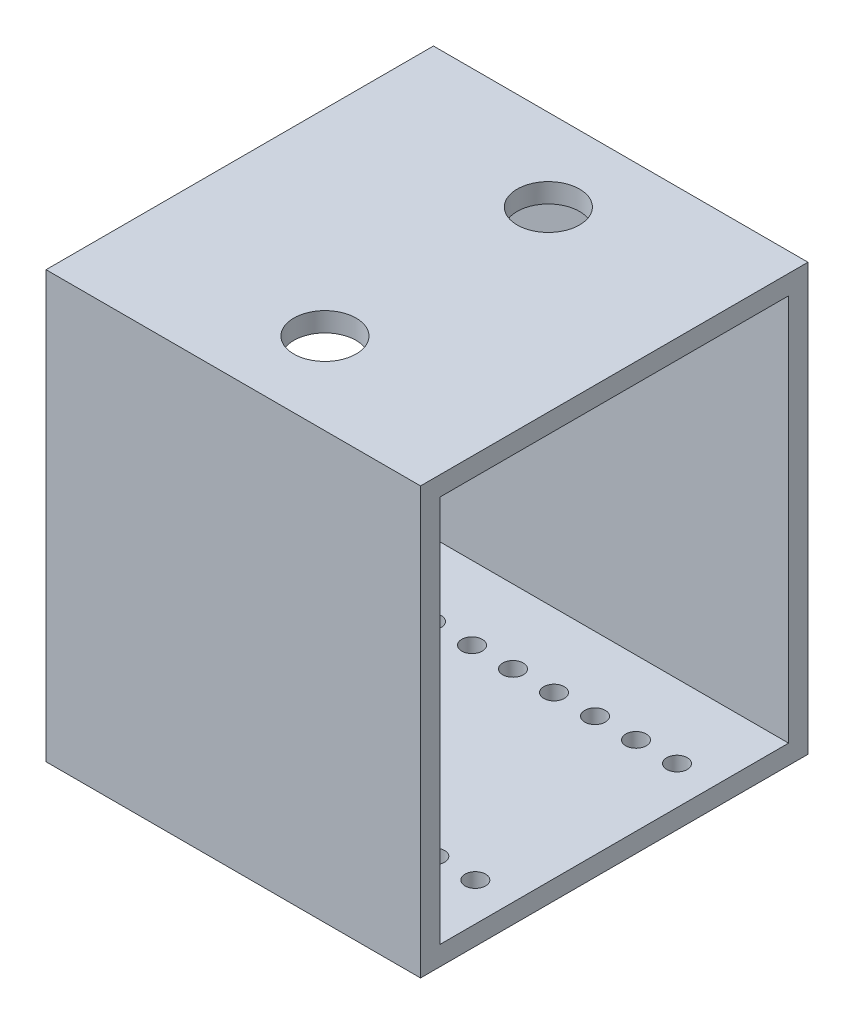
ISO-10303-21;
HEADER;
FILE_DESCRIPTION(('STEP AP214'),'2;1');
FILE_NAME('part.step','',(''),(''),'','','');
FILE_SCHEMA(('AUTOMOTIVE_DESIGN { 1 0 10303 214 1 1 1 1 }'));
ENDSEC;
DATA;
#1=APPLICATION_CONTEXT('core data for automotive mechanical design processes');
#2=APPLICATION_PROTOCOL_DEFINITION('international standard','automotive_design',2000,#1);
#3=PRODUCT_CONTEXT('',#1,'mechanical');
#4=PRODUCT('Part','Part','',(#3));
#5=PRODUCT_RELATED_PRODUCT_CATEGORY('part','',(#4));
#6=PRODUCT_DEFINITION_FORMATION('','',#4);
#7=PRODUCT_DEFINITION_CONTEXT('part definition',#1,'design');
#8=PRODUCT_DEFINITION('design','',#6,#7);
#9=PRODUCT_DEFINITION_SHAPE('','',#8);
#10=(LENGTH_UNIT() NAMED_UNIT(*) SI_UNIT(.MILLI.,.METRE.));
#11=(NAMED_UNIT(*) PLANE_ANGLE_UNIT() SI_UNIT($,.RADIAN.));
#12=(NAMED_UNIT(*) SI_UNIT($,.STERADIAN.) SOLID_ANGLE_UNIT());
#13=UNCERTAINTY_MEASURE_WITH_UNIT(LENGTH_MEASURE(1.E-05),#10,'distance_accuracy_value','');
#14=(GEOMETRIC_REPRESENTATION_CONTEXT(3) GLOBAL_UNCERTAINTY_ASSIGNED_CONTEXT((#13)) GLOBAL_UNIT_ASSIGNED_CONTEXT((#10,
#11,#12)) REPRESENTATION_CONTEXT('',''));
#15=CARTESIAN_POINT('',(0.,0.,0.));
#16=DIRECTION('',(0.,0.,1.));
#17=DIRECTION('',(1.,0.,0.));
#18=AXIS2_PLACEMENT_3D('',#15,#16,#17);
#19=CARTESIAN_POINT('',(-47.,-30.,60.));
#20=DIRECTION('',(0.,-1.,0.));
#21=DIRECTION('',(0.,0.,-1.));
#22=AXIS2_PLACEMENT_3D('',#19,#20,#21);
#23=PLANE('',#22);
#24=CARTESIAN_POINT('',(-23.3,-30.,14.38));
#25=DIRECTION('',(0.,-1.,0.));
#26=DIRECTION('',(0.,0.,-1.));
#27=AXIS2_PLACEMENT_3D('',#24,#25,#26);
#28=CIRCLE('',#27,1.59);
#29=CARTESIAN_POINT('',(-23.3,-30.,12.79));
#30=VERTEX_POINT('',#29);
#31=EDGE_CURVE('E294',#30,#30,#28,.F.);
#32=ORIENTED_EDGE('',*,*,#31,.F.);
#33=EDGE_LOOP('',(#32));
#34=FACE_BOUND('',#33,.T.);
#35=CARTESIAN_POINT('',(-29.65,-30.,14.38));
#36=DIRECTION('',(0.,-1.,0.));
#37=DIRECTION('',(0.,0.,-1.));
#38=AXIS2_PLACEMENT_3D('',#35,#36,#37);
#39=CIRCLE('',#38,1.59);
#40=CARTESIAN_POINT('',(-29.65,-30.,12.79));
#41=VERTEX_POINT('',#40);
#42=EDGE_CURVE('E288',#41,#41,#39,.F.);
#43=ORIENTED_EDGE('',*,*,#42,.F.);
#44=EDGE_LOOP('',(#43));
#45=FACE_BOUND('',#44,.T.);
#46=CARTESIAN_POINT('',(2.10000000000001,-30.,45.62));
#47=DIRECTION('',(0.,-1.,0.));
#48=DIRECTION('',(0.,0.,-1.));
#49=AXIS2_PLACEMENT_3D('',#46,#47,#48);
#50=CIRCLE('',#49,1.59);
#51=CARTESIAN_POINT('',(2.10000000000001,-30.,44.03));
#52=VERTEX_POINT('',#51);
#53=EDGE_CURVE('E281',#52,#52,#50,.F.);
#54=ORIENTED_EDGE('',*,*,#53,.F.);
#55=EDGE_LOOP('',(#54));
#56=FACE_BOUND('',#55,.T.);
#57=CARTESIAN_POINT('',(-4.24999999999999,-30.,45.62));
#58=DIRECTION('',(0.,-1.,0.));
#59=DIRECTION('',(0.,0.,-1.));
#60=AXIS2_PLACEMENT_3D('',#57,#58,#59);
#61=CIRCLE('',#60,1.59);
#62=CARTESIAN_POINT('',(-4.24999999999999,-30.,44.03));
#63=VERTEX_POINT('',#62);
#64=EDGE_CURVE('E280',#63,#63,#61,.F.);
#65=ORIENTED_EDGE('',*,*,#64,.F.);
#66=EDGE_LOOP('',(#65));
#67=FACE_BOUND('',#66,.T.);
#68=CARTESIAN_POINT('',(-10.6,-30.,45.62));
#69=DIRECTION('',(0.,-1.,0.));
#70=DIRECTION('',(0.,0.,-1.));
#71=AXIS2_PLACEMENT_3D('',#68,#69,#70);
#72=CIRCLE('',#71,1.59);
#73=CARTESIAN_POINT('',(-10.6,-30.,44.03));
#74=VERTEX_POINT('',#73);
#75=EDGE_CURVE('E318',#74,#74,#72,.F.);
#76=ORIENTED_EDGE('',*,*,#75,.F.);
#77=EDGE_LOOP('',(#76));
#78=FACE_BOUND('',#77,.T.);
#79=CARTESIAN_POINT('',(-16.95,-30.,45.62));
#80=DIRECTION('',(0.,-1.,0.));
#81=DIRECTION('',(0.,0.,-1.));
#82=AXIS2_PLACEMENT_3D('',#79,#80,#81);
#83=CIRCLE('',#82,1.59);
#84=CARTESIAN_POINT('',(-16.95,-30.,44.03));
#85=VERTEX_POINT('',#84);
#86=EDGE_CURVE('E312',#85,#85,#83,.F.);
#87=ORIENTED_EDGE('',*,*,#86,.F.);
#88=EDGE_LOOP('',(#87));
#89=FACE_BOUND('',#88,.T.);
#90=CARTESIAN_POINT('',(-23.3,-30.,45.62));
#91=DIRECTION('',(0.,-1.,0.));
#92=DIRECTION('',(0.,0.,-1.));
#93=AXIS2_PLACEMENT_3D('',#90,#91,#92);
#94=CIRCLE('',#93,1.59);
#95=CARTESIAN_POINT('',(-23.3,-30.,44.03));
#96=VERTEX_POINT('',#95);
#97=EDGE_CURVE('E305',#96,#96,#94,.F.);
#98=ORIENTED_EDGE('',*,*,#97,.F.);
#99=EDGE_LOOP('',(#98));
#100=FACE_BOUND('',#99,.T.);
#101=CARTESIAN_POINT('',(-29.65,-30.,45.62));
#102=DIRECTION('',(0.,-1.,0.));
#103=DIRECTION('',(0.,0.,-1.));
#104=AXIS2_PLACEMENT_3D('',#101,#102,#103);
#105=CIRCLE('',#104,1.59);
#106=CARTESIAN_POINT('',(-29.65,-30.,44.03));
#107=VERTEX_POINT('',#106);
#108=EDGE_CURVE('E304',#107,#107,#105,.F.);
#109=ORIENTED_EDGE('',*,*,#108,.F.);
#110=EDGE_LOOP('',(#109));
#111=FACE_BOUND('',#110,.T.);
#112=CARTESIAN_POINT('',(-16.95,-30.,14.38));
#113=DIRECTION('',(0.,-1.,0.));
#114=DIRECTION('',(0.,0.,-1.));
#115=AXIS2_PLACEMENT_3D('',#112,#113,#114);
#116=CIRCLE('',#115,1.59);
#117=CARTESIAN_POINT('',(-16.95,-30.,12.79));
#118=VERTEX_POINT('',#117);
#119=EDGE_CURVE('E250',#118,#118,#116,.F.);
#120=ORIENTED_EDGE('',*,*,#119,.F.);
#121=EDGE_LOOP('',(#120));
#122=FACE_BOUND('',#121,.T.);
#123=CARTESIAN_POINT('',(-10.6,-30.,14.38));
#124=DIRECTION('',(0.,-1.,0.));
#125=DIRECTION('',(0.,0.,-1.));
#126=AXIS2_PLACEMENT_3D('',#123,#124,#125);
#127=CIRCLE('',#126,1.59);
#128=CARTESIAN_POINT('',(-10.6,-30.,12.79));
#129=VERTEX_POINT('',#128);
#130=EDGE_CURVE('E251',#129,#129,#127,.F.);
#131=ORIENTED_EDGE('',*,*,#130,.F.);
#132=EDGE_LOOP('',(#131));
#133=FACE_BOUND('',#132,.T.);
#134=CARTESIAN_POINT('',(-4.24999999999999,-30.,14.38));
#135=DIRECTION('',(0.,-1.,0.));
#136=DIRECTION('',(0.,0.,-1.));
#137=AXIS2_PLACEMENT_3D('',#134,#135,#136);
#138=CIRCLE('',#137,1.59);
#139=CARTESIAN_POINT('',(-4.24999999999999,-30.,12.79));
#140=VERTEX_POINT('',#139);
#141=EDGE_CURVE('E258',#140,#140,#138,.F.);
#142=ORIENTED_EDGE('',*,*,#141,.F.);
#143=EDGE_LOOP('',(#142));
#144=FACE_BOUND('',#143,.T.);
#145=CARTESIAN_POINT('',(2.10000000000001,-30.,14.38));
#146=DIRECTION('',(0.,-1.,0.));
#147=DIRECTION('',(0.,0.,-1.));
#148=AXIS2_PLACEMENT_3D('',#145,#146,#147);
#149=CIRCLE('',#148,1.59);
#150=CARTESIAN_POINT('',(2.10000000000001,-30.,12.79));
#151=VERTEX_POINT('',#150);
#152=EDGE_CURVE('E264',#151,#151,#149,.F.);
#153=ORIENTED_EDGE('',*,*,#152,.F.);
#154=EDGE_LOOP('',(#153));
#155=FACE_BOUND('',#154,.T.);
#156=CARTESIAN_POINT('',(-36.,-30.,14.38));
#157=DIRECTION('',(0.,-1.,0.));
#158=DIRECTION('',(0.,0.,-1.));
#159=AXIS2_PLACEMENT_3D('',#156,#157,#158);
#160=CIRCLE('',#159,1.59);
#161=CARTESIAN_POINT('',(-36.,-30.,12.79));
#162=VERTEX_POINT('',#161);
#163=EDGE_CURVE('E270',#162,#162,#160,.F.);
#164=ORIENTED_EDGE('',*,*,#163,.F.);
#165=EDGE_LOOP('',(#164));
#166=FACE_BOUND('',#165,.T.);
#167=CARTESIAN_POINT('',(-36.,-30.,45.62));
#168=DIRECTION('',(0.,-1.,0.));
#169=DIRECTION('',(0.,0.,-1.));
#170=AXIS2_PLACEMENT_3D('',#167,#168,#169);
#171=CIRCLE('',#170,1.59);
#172=CARTESIAN_POINT('',(-36.,-30.,44.03));
#173=VERTEX_POINT('',#172);
#174=EDGE_CURVE('E327',#173,#173,#171,.F.);
#175=ORIENTED_EDGE('',*,*,#174,.F.);
#176=EDGE_LOOP('',(#175));
#177=FACE_BOUND('',#176,.T.);
#178=DIRECTION('',(-1.,0.,0.));
#179=VECTOR('',#178,1.);
#180=CARTESIAN_POINT('',(68.0749531835024,-30.,3.));
#181=LINE('',#180,#179);
#182=CARTESIAN_POINT('',(8.00000000000001,-30.,3.));
#183=VERTEX_POINT('',#182);
#184=CARTESIAN_POINT('',(-47.,-30.,3.));
#185=VERTEX_POINT('',#184);
#186=EDGE_CURVE('E87',#183,#185,#181,.T.);
#187=ORIENTED_EDGE('',*,*,#186,.T.);
#188=DIRECTION('',(0.,0.,-1.));
#189=VECTOR('',#188,1.);
#190=CARTESIAN_POINT('',(-47.,-30.,60.));
#191=LINE('',#190,#189);
#192=CARTESIAN_POINT('',(-47.,-30.,57.));
#193=VERTEX_POINT('',#192);
#194=EDGE_CURVE('E173',#193,#185,#191,.T.);
#195=ORIENTED_EDGE('',*,*,#194,.F.);
#196=DIRECTION('',(-1.,0.,0.));
#197=VECTOR('',#196,1.);
#198=CARTESIAN_POINT('',(68.0749531835024,-30.,57.));
#199=LINE('',#198,#197);
#200=CARTESIAN_POINT('',(8.00000000000001,-30.,57.));
#201=VERTEX_POINT('',#200);
#202=EDGE_CURVE('E162',#201,#193,#199,.T.);
#203=ORIENTED_EDGE('',*,*,#202,.F.);
#204=DIRECTION('',(0.,0.,-1.));
#205=VECTOR('',#204,1.);
#206=CARTESIAN_POINT('',(8.00000000000001,-30.,60.));
#207=LINE('',#206,#205);
#208=EDGE_CURVE('E177',#201,#183,#207,.T.);
#209=ORIENTED_EDGE('',*,*,#208,.T.);
#210=EDGE_LOOP('',(#187,#195,#203,#209));
#211=FACE_BOUND('',#210,.T.);
#212=ADVANCED_FACE('F70',(#34,#45,#56,#67,#78,#89,#100,#111,#122,#133,#144,#155,#166,#177,#211),
#23,.F.);
#213=CARTESIAN_POINT('',(-47.,30.,60.));
#214=DIRECTION('',(-1.,0.,0.));
#215=DIRECTION('',(0.,-1.,0.));
#216=AXIS2_PLACEMENT_3D('',#213,#214,#215);
#217=PLANE('',#216);
#218=DIRECTION('',(0.,0.,1.));
#219=VECTOR('',#218,1.);
#220=CARTESIAN_POINT('',(-47.,-24.,60.));
#221=LINE('',#220,#219);
#222=CARTESIAN_POINT('',(-47.,-24.,9.));
#223=VERTEX_POINT('',#222);
#224=CARTESIAN_POINT('',(-47.,-24.,51.));
#225=VERTEX_POINT('',#224);
#226=EDGE_CURVE('E79',#223,#225,#221,.T.);
#227=ORIENTED_EDGE('',*,*,#226,.T.);
#228=DIRECTION('',(0.,1.,0.));
#229=VECTOR('',#228,1.);
#230=CARTESIAN_POINT('',(-47.,30.,51.));
#231=LINE('',#230,#229);
#232=CARTESIAN_POINT('',(-47.,24.,51.));
#233=VERTEX_POINT('',#232);
#234=EDGE_CURVE('E12',#225,#233,#231,.T.);
#235=ORIENTED_EDGE('',*,*,#234,.T.);
#236=DIRECTION('',(0.,0.,-1.));
#237=VECTOR('',#236,1.);
#238=CARTESIAN_POINT('',(-47.,24.,60.));
#239=LINE('',#238,#237);
#240=CARTESIAN_POINT('',(-47.,24.,9.));
#241=VERTEX_POINT('',#240);
#242=EDGE_CURVE('E196',#233,#241,#239,.T.);
#243=ORIENTED_EDGE('',*,*,#242,.T.);
#244=DIRECTION('',(0.,-1.,0.));
#245=VECTOR('',#244,1.);
#246=CARTESIAN_POINT('',(-47.,30.,9.));
#247=LINE('',#246,#245);
#248=EDGE_CURVE('E199',#241,#223,#247,.T.);
#249=ORIENTED_EDGE('',*,*,#248,.T.);
#250=EDGE_LOOP('',(#227,#235,#243,#249));
#251=FACE_BOUND('',#250,.T.);
#252=DIRECTION('',(0.,-1.,0.));
#253=VECTOR('',#252,1.);
#254=CARTESIAN_POINT('',(-47.,30.,3.));
#255=LINE('',#254,#253);
#256=CARTESIAN_POINT('',(-47.,30.,3.));
#257=VERTEX_POINT('',#256);
#258=EDGE_CURVE('E94',#257,#185,#255,.T.);
#259=ORIENTED_EDGE('',*,*,#258,.F.);
#260=DIRECTION('',(0.,0.,-1.));
#261=VECTOR('',#260,1.);
#262=CARTESIAN_POINT('',(-47.,30.,60.));
#263=LINE('',#262,#261);
#264=CARTESIAN_POINT('',(-47.,30.,57.));
#265=VERTEX_POINT('',#264);
#266=EDGE_CURVE('E174',#265,#257,#263,.T.);
#267=ORIENTED_EDGE('',*,*,#266,.F.);
#268=DIRECTION('',(0.,1.,0.));
#269=VECTOR('',#268,1.);
#270=CARTESIAN_POINT('',(-47.,30.,57.));
#271=LINE('',#270,#269);
#272=EDGE_CURVE('E166',#193,#265,#271,.T.);
#273=ORIENTED_EDGE('',*,*,#272,.F.);
#274=ORIENTED_EDGE('',*,*,#194,.T.);
#275=EDGE_LOOP('',(#259,#267,#273,#274));
#276=FACE_BOUND('',#275,.T.);
#277=ADVANCED_FACE('F172',(#251,#276),#217,.F.);
#278=CARTESIAN_POINT('',(8.,30.,60.));
#279=DIRECTION('',(0.,1.,0.));
#280=DIRECTION('',(-1.,0.,0.));
#281=AXIS2_PLACEMENT_3D('',#278,#279,#280);
#282=PLANE('',#281);
#283=CARTESIAN_POINT('',(-19.5049853215936,30.,47.3));
#284=DIRECTION('',(0.,-1.,0.));
#285=DIRECTION('',(1.,0.,0.));
#286=AXIS2_PLACEMENT_3D('',#283,#284,#285);
#287=CIRCLE('',#286,4.82599999999999);
#288=CARTESIAN_POINT('',(-14.6789853215936,30.,47.3));
#289=VERTEX_POINT('',#288);
#290=EDGE_CURVE('E205',#289,#289,#287,.T.);
#291=ORIENTED_EDGE('',*,*,#290,.F.);
#292=EDGE_LOOP('',(#291));
#293=FACE_BOUND('',#292,.T.);
#294=CARTESIAN_POINT('',(-19.5049853215936,30.,12.7));
#295=DIRECTION('',(0.,-1.,0.));
#296=DIRECTION('',(-1.,0.,0.));
#297=AXIS2_PLACEMENT_3D('',#294,#295,#296);
#298=CIRCLE('',#297,4.82599999999999);
#299=CARTESIAN_POINT('',(-24.3309853215936,30.,12.7));
#300=VERTEX_POINT('',#299);
#301=EDGE_CURVE('E210',#300,#300,#298,.T.);
#302=ORIENTED_EDGE('',*,*,#301,.F.);
#303=EDGE_LOOP('',(#302));
#304=FACE_BOUND('',#303,.T.);
#305=DIRECTION('',(-1.,0.,0.));
#306=VECTOR('',#305,1.);
#307=CARTESIAN_POINT('',(68.0749531835024,30.,3.));
#308=LINE('',#307,#306);
#309=CARTESIAN_POINT('',(8.,30.,3.));
#310=VERTEX_POINT('',#309);
#311=EDGE_CURVE('E219',#310,#257,#308,.T.);
#312=ORIENTED_EDGE('',*,*,#311,.F.);
#313=DIRECTION('',(0.,0.,-1.));
#314=VECTOR('',#313,1.);
#315=CARTESIAN_POINT('',(8.,30.,60.));
#316=LINE('',#315,#314);
#317=CARTESIAN_POINT('',(8.00000000000001,30.,57.));
#318=VERTEX_POINT('',#317);
#319=EDGE_CURVE('E181',#318,#310,#316,.T.);
#320=ORIENTED_EDGE('',*,*,#319,.F.);
#321=DIRECTION('',(-1.,0.,0.));
#322=VECTOR('',#321,1.);
#323=CARTESIAN_POINT('',(68.0749531835024,30.,57.));
#324=LINE('',#323,#322);
#325=EDGE_CURVE('E170',#318,#265,#324,.T.);
#326=ORIENTED_EDGE('',*,*,#325,.T.);
#327=ORIENTED_EDGE('',*,*,#266,.T.);
#328=EDGE_LOOP('',(#312,#320,#326,#327));
#329=FACE_BOUND('',#328,.T.);
#330=ADVANCED_FACE('F356',(#293,#304,#329),#282,.F.);
#331=CARTESIAN_POINT('',(8.,33.,60.));
#332=DIRECTION('',(0.,-1.,0.));
#333=DIRECTION('',(1.,0.,0.));
#334=AXIS2_PLACEMENT_3D('',#331,#332,#333);
#335=PLANE('',#334);
#336=CARTESIAN_POINT('',(-19.5049853215936,33.,47.3));
#337=DIRECTION('',(0.,-1.,0.));
#338=DIRECTION('',(1.,0.,0.));
#339=AXIS2_PLACEMENT_3D('',#336,#337,#338);
#340=CIRCLE('',#339,4.82599999999999);
#341=CARTESIAN_POINT('',(-14.6789853215936,33.,47.3));
#342=VERTEX_POINT('',#341);
#343=EDGE_CURVE('E74',#342,#342,#340,.T.);
#344=ORIENTED_EDGE('',*,*,#343,.T.);
#345=EDGE_LOOP('',(#344));
#346=FACE_BOUND('',#345,.T.);
#347=CARTESIAN_POINT('',(-19.5049853215936,33.,12.7));
#348=DIRECTION('',(0.,-1.,0.));
#349=DIRECTION('',(1.,0.,0.));
#350=AXIS2_PLACEMENT_3D('',#347,#348,#349);
#351=CIRCLE('',#350,4.82599999999999);
#352=CARTESIAN_POINT('',(-14.6789853215936,33.,12.7));
#353=VERTEX_POINT('',#352);
#354=EDGE_CURVE('E203',#353,#353,#351,.T.);
#355=ORIENTED_EDGE('',*,*,#354,.T.);
#356=EDGE_LOOP('',(#355));
#357=FACE_BOUND('',#356,.T.);
#358=DIRECTION('',(-1.,0.,0.));
#359=VECTOR('',#358,1.);
#360=CARTESIAN_POINT('',(8.,33.,0.));
#361=LINE('',#360,#359);
#362=CARTESIAN_POINT('',(8.,33.,0.));
#363=VERTEX_POINT('',#362);
#364=CARTESIAN_POINT('',(-50.,33.,0.));
#365=VERTEX_POINT('',#364);
#366=EDGE_CURVE('E330',#363,#365,#361,.T.);
#367=ORIENTED_EDGE('',*,*,#366,.T.);
#368=DIRECTION('',(0.,0.,-1.));
#369=VECTOR('',#368,1.);
#370=CARTESIAN_POINT('',(-50.,33.,60.));
#371=LINE('',#370,#369);
#372=CARTESIAN_POINT('',(-50.,33.,60.));
#373=VERTEX_POINT('',#372);
#374=EDGE_CURVE('E190',#373,#365,#371,.T.);
#375=ORIENTED_EDGE('',*,*,#374,.F.);
#376=DIRECTION('',(-1.,0.,0.));
#377=VECTOR('',#376,1.);
#378=CARTESIAN_POINT('',(8.,33.,60.));
#379=LINE('',#378,#377);
#380=CARTESIAN_POINT('',(8.,33.,60.));
#381=VERTEX_POINT('',#380);
#382=EDGE_CURVE('E334',#381,#373,#379,.T.);
#383=ORIENTED_EDGE('',*,*,#382,.F.);
#384=DIRECTION('',(0.,0.,-1.));
#385=VECTOR('',#384,1.);
#386=CARTESIAN_POINT('',(8.,33.,60.));
#387=LINE('',#386,#385);
#388=EDGE_CURVE('E193',#381,#363,#387,.T.);
#389=ORIENTED_EDGE('',*,*,#388,.T.);
#390=EDGE_LOOP('',(#367,#375,#383,#389));
#391=FACE_BOUND('',#390,.T.);
#392=ADVANCED_FACE('F72',(#346,#357,#391),#335,.F.);
#393=CARTESIAN_POINT('',(-50.,33.,60.));
#394=DIRECTION('',(1.,0.,0.));
#395=DIRECTION('',(0.,1.,0.));
#396=AXIS2_PLACEMENT_3D('',#393,#394,#395);
#397=PLANE('',#396);
#398=DIRECTION('',(0.,0.,-1.));
#399=VECTOR('',#398,1.);
#400=CARTESIAN_POINT('',(-50.,24.,9.));
#401=LINE('',#400,#399);
#402=CARTESIAN_POINT('',(-50.,24.,51.));
#403=VERTEX_POINT('',#402);
#404=CARTESIAN_POINT('',(-50.,24.,9.));
#405=VERTEX_POINT('',#404);
#406=EDGE_CURVE('E228',#403,#405,#401,.T.);
#407=ORIENTED_EDGE('',*,*,#406,.F.);
#408=DIRECTION('',(0.,1.,0.));
#409=VECTOR('',#408,1.);
#410=CARTESIAN_POINT('',(-50.,24.,51.));
#411=LINE('',#410,#409);
#412=CARTESIAN_POINT('',(-50.,-24.,51.));
#413=VERTEX_POINT('',#412);
#414=EDGE_CURVE('E226',#413,#403,#411,.T.);
#415=ORIENTED_EDGE('',*,*,#414,.F.);
#416=DIRECTION('',(0.,0.,1.));
#417=VECTOR('',#416,1.);
#418=CARTESIAN_POINT('',(-50.,-24.,9.));
#419=LINE('',#418,#417);
#420=CARTESIAN_POINT('',(-50.,-24.,9.));
#421=VERTEX_POINT('',#420);
#422=EDGE_CURVE('E234',#421,#413,#419,.T.);
#423=ORIENTED_EDGE('',*,*,#422,.F.);
#424=DIRECTION('',(0.,-1.,0.));
#425=VECTOR('',#424,1.);
#426=CARTESIAN_POINT('',(-50.,24.,9.));
#427=LINE('',#426,#425);
#428=EDGE_CURVE('E231',#405,#421,#427,.T.);
#429=ORIENTED_EDGE('',*,*,#428,.F.);
#430=EDGE_LOOP('',(#407,#415,#423,#429));
#431=FACE_BOUND('',#430,.T.);
#432=DIRECTION('',(0.,-1.,0.));
#433=VECTOR('',#432,1.);
#434=CARTESIAN_POINT('',(-50.,33.,0.));
#435=LINE('',#434,#433);
#436=CARTESIAN_POINT('',(-50.,-33.,0.));
#437=VERTEX_POINT('',#436);
#438=EDGE_CURVE('E343',#365,#437,#435,.T.);
#439=ORIENTED_EDGE('',*,*,#438,.T.);
#440=DIRECTION('',(0.,0.,-1.));
#441=VECTOR('',#440,1.);
#442=CARTESIAN_POINT('',(-50.,-33.,60.));
#443=LINE('',#442,#441);
#444=CARTESIAN_POINT('',(-50.,-33.,60.));
#445=VERTEX_POINT('',#444);
#446=EDGE_CURVE('E187',#445,#437,#443,.T.);
#447=ORIENTED_EDGE('',*,*,#446,.F.);
#448=DIRECTION('',(0.,-1.,0.));
#449=VECTOR('',#448,1.);
#450=CARTESIAN_POINT('',(-50.,33.,60.));
#451=LINE('',#450,#449);
#452=EDGE_CURVE('E337',#373,#445,#451,.T.);
#453=ORIENTED_EDGE('',*,*,#452,.F.);
#454=ORIENTED_EDGE('',*,*,#374,.T.);
#455=EDGE_LOOP('',(#439,#447,#453,#454));
#456=FACE_BOUND('',#455,.T.);
#457=ADVANCED_FACE('F364',(#431,#456),#397,.F.);
#458=CARTESIAN_POINT('',(-50.,-33.,60.));
#459=DIRECTION('',(0.,1.,0.));
#460=DIRECTION('',(0.,0.,1.));
#461=AXIS2_PLACEMENT_3D('',#458,#459,#460);
#462=PLANE('',#461);
#463=CARTESIAN_POINT('',(-23.3,-33.,14.38));
#464=DIRECTION('',(0.,-1.,0.));
#465=DIRECTION('',(0.,0.,-1.));
#466=AXIS2_PLACEMENT_3D('',#463,#464,#465);
#467=CIRCLE('',#466,1.59);
#468=CARTESIAN_POINT('',(-23.3,-33.,12.79));
#469=VERTEX_POINT('',#468);
#470=EDGE_CURVE('E254',#469,#469,#467,.T.);
#471=ORIENTED_EDGE('',*,*,#470,.F.);
#472=EDGE_LOOP('',(#471));
#473=FACE_BOUND('',#472,.T.);
#474=CARTESIAN_POINT('',(-29.65,-33.,14.38));
#475=DIRECTION('',(0.,-1.,0.));
#476=DIRECTION('',(0.,0.,-1.));
#477=AXIS2_PLACEMENT_3D('',#474,#475,#476);
#478=CIRCLE('',#477,1.59);
#479=CARTESIAN_POINT('',(-29.65,-33.,12.79));
#480=VERTEX_POINT('',#479);
#481=EDGE_CURVE('E291',#480,#480,#478,.T.);
#482=ORIENTED_EDGE('',*,*,#481,.F.);
#483=EDGE_LOOP('',(#482));
#484=FACE_BOUND('',#483,.T.);
#485=CARTESIAN_POINT('',(2.10000000000001,-33.,45.62));
#486=DIRECTION('',(0.,-1.,0.));
#487=DIRECTION('',(0.,0.,-1.));
#488=AXIS2_PLACEMENT_3D('',#485,#486,#487);
#489=CIRCLE('',#488,1.59);
#490=CARTESIAN_POINT('',(2.10000000000001,-33.,44.03));
#491=VERTEX_POINT('',#490);
#492=EDGE_CURVE('E285',#491,#491,#489,.T.);
#493=ORIENTED_EDGE('',*,*,#492,.F.);
#494=EDGE_LOOP('',(#493));
#495=FACE_BOUND('',#494,.T.);
#496=CARTESIAN_POINT('',(-4.24999999999999,-33.,45.62));
#497=DIRECTION('',(0.,-1.,0.));
#498=DIRECTION('',(0.,0.,-1.));
#499=AXIS2_PLACEMENT_3D('',#496,#497,#498);
#500=CIRCLE('',#499,1.59);
#501=CARTESIAN_POINT('',(-4.24999999999999,-33.,44.03));
#502=VERTEX_POINT('',#501);
#503=EDGE_CURVE('E277',#502,#502,#500,.T.);
#504=ORIENTED_EDGE('',*,*,#503,.F.);
#505=EDGE_LOOP('',(#504));
#506=FACE_BOUND('',#505,.T.);
#507=CARTESIAN_POINT('',(-10.6,-33.,45.62));
#508=DIRECTION('',(0.,-1.,0.));
#509=DIRECTION('',(0.,0.,-1.));
#510=AXIS2_PLACEMENT_3D('',#507,#508,#509);
#511=CIRCLE('',#510,1.59);
#512=CARTESIAN_POINT('',(-10.6,-33.,44.03));
#513=VERTEX_POINT('',#512);
#514=EDGE_CURVE('E284',#513,#513,#511,.T.);
#515=ORIENTED_EDGE('',*,*,#514,.F.);
#516=EDGE_LOOP('',(#515));
#517=FACE_BOUND('',#516,.T.);
#518=CARTESIAN_POINT('',(-16.95,-33.,45.62));
#519=DIRECTION('',(0.,-1.,0.));
#520=DIRECTION('',(0.,0.,-1.));
#521=AXIS2_PLACEMENT_3D('',#518,#519,#520);
#522=CIRCLE('',#521,1.59);
#523=CARTESIAN_POINT('',(-16.95,-33.,44.03));
#524=VERTEX_POINT('',#523);
#525=EDGE_CURVE('E315',#524,#524,#522,.T.);
#526=ORIENTED_EDGE('',*,*,#525,.F.);
#527=EDGE_LOOP('',(#526));
#528=FACE_BOUND('',#527,.T.);
#529=CARTESIAN_POINT('',(-23.3,-33.,45.62));
#530=DIRECTION('',(0.,-1.,0.));
#531=DIRECTION('',(0.,0.,-1.));
#532=AXIS2_PLACEMENT_3D('',#529,#530,#531);
#533=CIRCLE('',#532,1.59);
#534=CARTESIAN_POINT('',(-23.3,-33.,44.03));
#535=VERTEX_POINT('',#534);
#536=EDGE_CURVE('E309',#535,#535,#533,.T.);
#537=ORIENTED_EDGE('',*,*,#536,.F.);
#538=EDGE_LOOP('',(#537));
#539=FACE_BOUND('',#538,.T.);
#540=CARTESIAN_POINT('',(-29.65,-33.,45.62));
#541=DIRECTION('',(0.,-1.,0.));
#542=DIRECTION('',(0.,0.,-1.));
#543=AXIS2_PLACEMENT_3D('',#540,#541,#542);
#544=CIRCLE('',#543,1.59);
#545=CARTESIAN_POINT('',(-29.65,-33.,44.03));
#546=VERTEX_POINT('',#545);
#547=EDGE_CURVE('E301',#546,#546,#544,.T.);
#548=ORIENTED_EDGE('',*,*,#547,.F.);
#549=EDGE_LOOP('',(#548));
#550=FACE_BOUND('',#549,.T.);
#551=CARTESIAN_POINT('',(-16.95,-33.,14.38));
#552=DIRECTION('',(0.,-1.,0.));
#553=DIRECTION('',(0.,0.,-1.));
#554=AXIS2_PLACEMENT_3D('',#551,#552,#553);
#555=CIRCLE('',#554,1.59);
#556=CARTESIAN_POINT('',(-16.95,-33.,12.79));
#557=VERTEX_POINT('',#556);
#558=EDGE_CURVE('E247',#557,#557,#555,.T.);
#559=ORIENTED_EDGE('',*,*,#558,.F.);
#560=EDGE_LOOP('',(#559));
#561=FACE_BOUND('',#560,.T.);
#562=CARTESIAN_POINT('',(-10.6,-33.,14.38));
#563=DIRECTION('',(0.,-1.,0.));
#564=DIRECTION('',(0.,0.,-1.));
#565=AXIS2_PLACEMENT_3D('',#562,#563,#564);
#566=CIRCLE('',#565,1.59);
#567=CARTESIAN_POINT('',(-10.6,-33.,12.79));
#568=VERTEX_POINT('',#567);
#569=EDGE_CURVE('E255',#568,#568,#566,.T.);
#570=ORIENTED_EDGE('',*,*,#569,.F.);
#571=EDGE_LOOP('',(#570));
#572=FACE_BOUND('',#571,.T.);
#573=CARTESIAN_POINT('',(-4.24999999999999,-33.,14.38));
#574=DIRECTION('',(0.,-1.,0.));
#575=DIRECTION('',(0.,0.,-1.));
#576=AXIS2_PLACEMENT_3D('',#573,#574,#575);
#577=CIRCLE('',#576,1.59);
#578=CARTESIAN_POINT('',(-4.24999999999999,-33.,12.79));
#579=VERTEX_POINT('',#578);
#580=EDGE_CURVE('E261',#579,#579,#577,.T.);
#581=ORIENTED_EDGE('',*,*,#580,.F.);
#582=EDGE_LOOP('',(#581));
#583=FACE_BOUND('',#582,.T.);
#584=CARTESIAN_POINT('',(2.10000000000001,-33.,14.38));
#585=DIRECTION('',(0.,-1.,0.));
#586=DIRECTION('',(0.,0.,-1.));
#587=AXIS2_PLACEMENT_3D('',#584,#585,#586);
#588=CIRCLE('',#587,1.59);
#589=CARTESIAN_POINT('',(2.10000000000001,-33.,12.79));
#590=VERTEX_POINT('',#589);
#591=EDGE_CURVE('E267',#590,#590,#588,.T.);
#592=ORIENTED_EDGE('',*,*,#591,.F.);
#593=EDGE_LOOP('',(#592));
#594=FACE_BOUND('',#593,.T.);
#595=CARTESIAN_POINT('',(-36.,-33.,14.38));
#596=DIRECTION('',(0.,-1.,0.));
#597=DIRECTION('',(0.,0.,-1.));
#598=AXIS2_PLACEMENT_3D('',#595,#596,#597);
#599=CIRCLE('',#598,1.59);
#600=CARTESIAN_POINT('',(-36.,-33.,12.79));
#601=VERTEX_POINT('',#600);
#602=EDGE_CURVE('E240',#601,#601,#599,.T.);
#603=ORIENTED_EDGE('',*,*,#602,.F.);
#604=EDGE_LOOP('',(#603));
#605=FACE_BOUND('',#604,.T.);
#606=CARTESIAN_POINT('',(-36.,-33.,45.62));
#607=DIRECTION('',(0.,-1.,0.));
#608=DIRECTION('',(0.,0.,-1.));
#609=AXIS2_PLACEMENT_3D('',#606,#607,#608);
#610=CIRCLE('',#609,1.59);
#611=CARTESIAN_POINT('',(-36.,-33.,44.03));
#612=VERTEX_POINT('',#611);
#613=EDGE_CURVE('E308',#612,#612,#610,.T.);
#614=ORIENTED_EDGE('',*,*,#613,.F.);
#615=EDGE_LOOP('',(#614));
#616=FACE_BOUND('',#615,.T.);
#617=DIRECTION('',(1.,0.,0.));
#618=VECTOR('',#617,1.);
#619=CARTESIAN_POINT('',(-50.,-33.,0.));
#620=LINE('',#619,#618);
#621=CARTESIAN_POINT('',(8.00000000000001,-33.,0.));
#622=VERTEX_POINT('',#621);
#623=EDGE_CURVE('E345',#437,#622,#620,.T.);
#624=ORIENTED_EDGE('',*,*,#623,.T.);
#625=DIRECTION('',(0.,0.,-1.));
#626=VECTOR('',#625,1.);
#627=CARTESIAN_POINT('',(8.00000000000001,-33.,60.));
#628=LINE('',#627,#626);
#629=CARTESIAN_POINT('',(8.00000000000001,-33.,60.));
#630=VERTEX_POINT('',#629);
#631=EDGE_CURVE('E179',#630,#622,#628,.T.);
#632=ORIENTED_EDGE('',*,*,#631,.F.);
#633=DIRECTION('',(1.,0.,0.));
#634=VECTOR('',#633,1.);
#635=CARTESIAN_POINT('',(-50.,-33.,60.));
#636=LINE('',#635,#634);
#637=EDGE_CURVE('E339',#445,#630,#636,.T.);
#638=ORIENTED_EDGE('',*,*,#637,.F.);
#639=ORIENTED_EDGE('',*,*,#446,.T.);
#640=EDGE_LOOP('',(#624,#632,#638,#639));
#641=FACE_BOUND('',#640,.T.);
#642=ADVANCED_FACE('F381',(#473,#484,#495,#506,#517,#528,#539,#550,#561,#572,#583,#594,#605,
#616,#641),#462,.F.);
#643=CARTESIAN_POINT('',(8.00000000000001,-30.,60.));
#644=DIRECTION('',(-1.,0.,0.));
#645=DIRECTION('',(0.,0.,1.));
#646=AXIS2_PLACEMENT_3D('',#643,#644,#645);
#647=PLANE('',#646);
#648=DIRECTION('',(0.,1.,0.));
#649=VECTOR('',#648,1.);
#650=CARTESIAN_POINT('',(8.00000000000001,30.,3.));
#651=LINE('',#650,#649);
#652=EDGE_CURVE('E175',#183,#310,#651,.T.);
#653=ORIENTED_EDGE('',*,*,#652,.F.);
#654=ORIENTED_EDGE('',*,*,#208,.F.);
#655=DIRECTION('',(0.,-1.,0.));
#656=VECTOR('',#655,1.);
#657=CARTESIAN_POINT('',(8.00000000000001,30.,57.));
#658=LINE('',#657,#656);
#659=EDGE_CURVE('E168',#318,#201,#658,.T.);
#660=ORIENTED_EDGE('',*,*,#659,.F.);
#661=ORIENTED_EDGE('',*,*,#319,.T.);
#662=EDGE_LOOP('',(#653,#654,#660,#661));
#663=FACE_BOUND('',#662,.T.);
#664=DIRECTION('',(0.,1.,0.));
#665=VECTOR('',#664,1.);
#666=CARTESIAN_POINT('',(8.00000000000001,-30.,0.));
#667=LINE('',#666,#665);
#668=EDGE_CURVE('E335',#622,#363,#667,.T.);
#669=ORIENTED_EDGE('',*,*,#668,.T.);
#670=ORIENTED_EDGE('',*,*,#388,.F.);
#671=DIRECTION('',(0.,1.,0.));
#672=VECTOR('',#671,1.);
#673=CARTESIAN_POINT('',(8.,30.,60.));
#674=LINE('',#673,#672);
#675=EDGE_CURVE('E331',#630,#381,#674,.T.);
#676=ORIENTED_EDGE('',*,*,#675,.F.);
#677=ORIENTED_EDGE('',*,*,#631,.T.);
#678=EDGE_LOOP('',(#669,#670,#676,#677));
#679=FACE_BOUND('',#678,.T.);
#680=ADVANCED_FACE('F351',(#663,#679),#647,.F.);
#681=CARTESIAN_POINT('',(0.,0.,60.));
#682=DIRECTION('',(0.,0.,1.));
#683=DIRECTION('',(1.,0.,0.));
#684=AXIS2_PLACEMENT_3D('',#681,#682,#683);
#685=PLANE('',#684);
#686=ORIENTED_EDGE('',*,*,#675,.T.);
#687=ORIENTED_EDGE('',*,*,#382,.T.);
#688=ORIENTED_EDGE('',*,*,#452,.T.);
#689=ORIENTED_EDGE('',*,*,#637,.T.);
#690=EDGE_LOOP('',(#686,#687,#688,#689));
#691=FACE_BOUND('',#690,.T.);
#692=ADVANCED_FACE('F380',(#691),#685,.T.);
#693=CARTESIAN_POINT('',(0.,0.,0.));
#694=DIRECTION('',(0.,0.,1.));
#695=DIRECTION('',(1.,0.,0.));
#696=AXIS2_PLACEMENT_3D('',#693,#694,#695);
#697=PLANE('',#696);
#698=ORIENTED_EDGE('',*,*,#366,.F.);
#699=ORIENTED_EDGE('',*,*,#668,.F.);
#700=ORIENTED_EDGE('',*,*,#623,.F.);
#701=ORIENTED_EDGE('',*,*,#438,.F.);
#702=EDGE_LOOP('',(#698,#699,#700,#701));
#703=FACE_BOUND('',#702,.T.);
#704=ADVANCED_FACE('F403',(#703),#697,.F.);
#705=CARTESIAN_POINT('',(-36.,33.001,45.62));
#706=DIRECTION('',(0.,-1.,0.));
#707=DIRECTION('',(0.,0.,-1.));
#708=AXIS2_PLACEMENT_3D('',#705,#706,#707);
#709=CYLINDRICAL_SURFACE('',#708,1.59);
#710=ORIENTED_EDGE('',*,*,#613,.T.);
#711=EDGE_LOOP('',(#710));
#712=FACE_BOUND('',#711,.T.);
#713=ORIENTED_EDGE('',*,*,#174,.T.);
#714=EDGE_LOOP('',(#713));
#715=FACE_BOUND('',#714,.T.);
#716=ADVANCED_FACE('F412',(#712,#715),#709,.F.);
#717=CARTESIAN_POINT('',(-36.,33.001,14.38));
#718=DIRECTION('',(0.,-1.,0.));
#719=DIRECTION('',(0.,0.,-1.));
#720=AXIS2_PLACEMENT_3D('',#717,#718,#719);
#721=CYLINDRICAL_SURFACE('',#720,1.59);
#722=ORIENTED_EDGE('',*,*,#602,.T.);
#723=EDGE_LOOP('',(#722));
#724=FACE_BOUND('',#723,.T.);
#725=ORIENTED_EDGE('',*,*,#163,.T.);
#726=EDGE_LOOP('',(#725));
#727=FACE_BOUND('',#726,.T.);
#728=ADVANCED_FACE('F416',(#724,#727),#721,.F.);
#729=CARTESIAN_POINT('',(2.10000000000001,33.001,14.38));
#730=DIRECTION('',(0.,-1.,0.));
#731=DIRECTION('',(0.,0.,-1.));
#732=AXIS2_PLACEMENT_3D('',#729,#730,#731);
#733=CYLINDRICAL_SURFACE('',#732,1.59);
#734=ORIENTED_EDGE('',*,*,#591,.T.);
#735=EDGE_LOOP('',(#734));
#736=FACE_BOUND('',#735,.T.);
#737=ORIENTED_EDGE('',*,*,#152,.T.);
#738=EDGE_LOOP('',(#737));
#739=FACE_BOUND('',#738,.T.);
#740=ADVANCED_FACE('F454',(#736,#739),#733,.F.);
#741=CARTESIAN_POINT('',(-4.24999999999999,33.001,14.38));
#742=DIRECTION('',(0.,-1.,0.));
#743=DIRECTION('',(0.,0.,-1.));
#744=AXIS2_PLACEMENT_3D('',#741,#742,#743);
#745=CYLINDRICAL_SURFACE('',#744,1.59);
#746=ORIENTED_EDGE('',*,*,#580,.T.);
#747=EDGE_LOOP('',(#746));
#748=FACE_BOUND('',#747,.T.);
#749=ORIENTED_EDGE('',*,*,#141,.T.);
#750=EDGE_LOOP('',(#749));
#751=FACE_BOUND('',#750,.T.);
#752=ADVANCED_FACE('F458',(#748,#751),#745,.F.);
#753=CARTESIAN_POINT('',(-10.6,33.001,14.38));
#754=DIRECTION('',(0.,-1.,0.));
#755=DIRECTION('',(0.,0.,-1.));
#756=AXIS2_PLACEMENT_3D('',#753,#754,#755);
#757=CYLINDRICAL_SURFACE('',#756,1.59);
#758=ORIENTED_EDGE('',*,*,#569,.T.);
#759=EDGE_LOOP('',(#758));
#760=FACE_BOUND('',#759,.T.);
#761=ORIENTED_EDGE('',*,*,#130,.T.);
#762=EDGE_LOOP('',(#761));
#763=FACE_BOUND('',#762,.T.);
#764=ADVANCED_FACE('F462',(#760,#763),#757,.F.);
#765=CARTESIAN_POINT('',(-16.95,33.001,14.38));
#766=DIRECTION('',(0.,-1.,0.));
#767=DIRECTION('',(0.,0.,-1.));
#768=AXIS2_PLACEMENT_3D('',#765,#766,#767);
#769=CYLINDRICAL_SURFACE('',#768,1.59);
#770=ORIENTED_EDGE('',*,*,#558,.T.);
#771=EDGE_LOOP('',(#770));
#772=FACE_BOUND('',#771,.T.);
#773=ORIENTED_EDGE('',*,*,#119,.T.);
#774=EDGE_LOOP('',(#773));
#775=FACE_BOUND('',#774,.T.);
#776=ADVANCED_FACE('F434',(#772,#775),#769,.F.);
#777=CARTESIAN_POINT('',(-29.65,33.001,45.62));
#778=DIRECTION('',(0.,-1.,0.));
#779=DIRECTION('',(0.,0.,-1.));
#780=AXIS2_PLACEMENT_3D('',#777,#778,#779);
#781=CYLINDRICAL_SURFACE('',#780,1.59);
#782=ORIENTED_EDGE('',*,*,#547,.T.);
#783=EDGE_LOOP('',(#782));
#784=FACE_BOUND('',#783,.T.);
#785=ORIENTED_EDGE('',*,*,#108,.T.);
#786=EDGE_LOOP('',(#785));
#787=FACE_BOUND('',#786,.T.);
#788=ADVANCED_FACE('F430',(#784,#787),#781,.F.);
#789=CARTESIAN_POINT('',(-23.3,33.001,45.62));
#790=DIRECTION('',(0.,-1.,0.));
#791=DIRECTION('',(0.,0.,-1.));
#792=AXIS2_PLACEMENT_3D('',#789,#790,#791);
#793=CYLINDRICAL_SURFACE('',#792,1.59);
#794=ORIENTED_EDGE('',*,*,#536,.T.);
#795=EDGE_LOOP('',(#794));
#796=FACE_BOUND('',#795,.T.);
#797=ORIENTED_EDGE('',*,*,#97,.T.);
#798=EDGE_LOOP('',(#797));
#799=FACE_BOUND('',#798,.T.);
#800=ADVANCED_FACE('F426',(#796,#799),#793,.F.);
#801=CARTESIAN_POINT('',(-16.95,33.001,45.62));
#802=DIRECTION('',(0.,-1.,0.));
#803=DIRECTION('',(0.,0.,-1.));
#804=AXIS2_PLACEMENT_3D('',#801,#802,#803);
#805=CYLINDRICAL_SURFACE('',#804,1.59);
#806=ORIENTED_EDGE('',*,*,#525,.T.);
#807=EDGE_LOOP('',(#806));
#808=FACE_BOUND('',#807,.T.);
#809=ORIENTED_EDGE('',*,*,#86,.T.);
#810=EDGE_LOOP('',(#809));
#811=FACE_BOUND('',#810,.T.);
#812=ADVANCED_FACE('F422',(#808,#811),#805,.F.);
#813=CARTESIAN_POINT('',(-10.6,33.001,45.62));
#814=DIRECTION('',(0.,-1.,0.));
#815=DIRECTION('',(0.,0.,-1.));
#816=AXIS2_PLACEMENT_3D('',#813,#814,#815);
#817=CYLINDRICAL_SURFACE('',#816,1.59);
#818=ORIENTED_EDGE('',*,*,#514,.T.);
#819=EDGE_LOOP('',(#818));
#820=FACE_BOUND('',#819,.T.);
#821=ORIENTED_EDGE('',*,*,#75,.T.);
#822=EDGE_LOOP('',(#821));
#823=FACE_BOUND('',#822,.T.);
#824=ADVANCED_FACE('F418',(#820,#823),#817,.F.);
#825=CARTESIAN_POINT('',(-4.24999999999999,33.001,45.62));
#826=DIRECTION('',(0.,-1.,0.));
#827=DIRECTION('',(0.,0.,-1.));
#828=AXIS2_PLACEMENT_3D('',#825,#826,#827);
#829=CYLINDRICAL_SURFACE('',#828,1.59);
#830=ORIENTED_EDGE('',*,*,#503,.T.);
#831=EDGE_LOOP('',(#830));
#832=FACE_BOUND('',#831,.T.);
#833=ORIENTED_EDGE('',*,*,#64,.T.);
#834=EDGE_LOOP('',(#833));
#835=FACE_BOUND('',#834,.T.);
#836=ADVANCED_FACE('F421',(#832,#835),#829,.F.);
#837=CARTESIAN_POINT('',(2.10000000000001,33.001,45.62));
#838=DIRECTION('',(0.,-1.,0.));
#839=DIRECTION('',(0.,0.,-1.));
#840=AXIS2_PLACEMENT_3D('',#837,#838,#839);
#841=CYLINDRICAL_SURFACE('',#840,1.59);
#842=ORIENTED_EDGE('',*,*,#492,.T.);
#843=EDGE_LOOP('',(#842));
#844=FACE_BOUND('',#843,.T.);
#845=ORIENTED_EDGE('',*,*,#53,.T.);
#846=EDGE_LOOP('',(#845));
#847=FACE_BOUND('',#846,.T.);
#848=ADVANCED_FACE('F444',(#844,#847),#841,.F.);
#849=CARTESIAN_POINT('',(-29.65,33.001,14.38));
#850=DIRECTION('',(0.,-1.,0.));
#851=DIRECTION('',(0.,0.,-1.));
#852=AXIS2_PLACEMENT_3D('',#849,#850,#851);
#853=CYLINDRICAL_SURFACE('',#852,1.59);
#854=ORIENTED_EDGE('',*,*,#481,.T.);
#855=EDGE_LOOP('',(#854));
#856=FACE_BOUND('',#855,.T.);
#857=ORIENTED_EDGE('',*,*,#42,.T.);
#858=EDGE_LOOP('',(#857));
#859=FACE_BOUND('',#858,.T.);
#860=ADVANCED_FACE('F440',(#856,#859),#853,.F.);
#861=CARTESIAN_POINT('',(-23.3,33.001,14.38));
#862=DIRECTION('',(0.,-1.,0.));
#863=DIRECTION('',(0.,0.,-1.));
#864=AXIS2_PLACEMENT_3D('',#861,#862,#863);
#865=CYLINDRICAL_SURFACE('',#864,1.59);
#866=ORIENTED_EDGE('',*,*,#470,.T.);
#867=EDGE_LOOP('',(#866));
#868=FACE_BOUND('',#867,.T.);
#869=ORIENTED_EDGE('',*,*,#31,.T.);
#870=EDGE_LOOP('',(#869));
#871=FACE_BOUND('',#870,.T.);
#872=ADVANCED_FACE('F436',(#868,#871),#865,.F.);
#873=CARTESIAN_POINT('',(9.99999999999999,24.,51.));
#874=DIRECTION('',(0.,0.,1.));
#875=DIRECTION('',(1.,0.,0.));
#876=AXIS2_PLACEMENT_3D('',#873,#874,#875);
#877=PLANE('',#876);
#878=DIRECTION('',(-1.,0.,0.));
#879=VECTOR('',#878,1.);
#880=CARTESIAN_POINT('',(9.99999999999999,-24.,51.));
#881=LINE('',#880,#879);
#882=EDGE_CURVE('E238',#225,#413,#881,.T.);
#883=ORIENTED_EDGE('',*,*,#882,.T.);
#884=ORIENTED_EDGE('',*,*,#414,.T.);
#885=DIRECTION('',(-1.,0.,0.));
#886=VECTOR('',#885,1.);
#887=CARTESIAN_POINT('',(9.99999999999999,24.,51.));
#888=LINE('',#887,#886);
#889=EDGE_CURVE('E237',#233,#403,#888,.T.);
#890=ORIENTED_EDGE('',*,*,#889,.F.);
#891=ORIENTED_EDGE('',*,*,#234,.F.);
#892=EDGE_LOOP('',(#883,#884,#890,#891));
#893=FACE_BOUND('',#892,.T.);
#894=ADVANCED_FACE('F439',(#893),#877,.F.);
#895=CARTESIAN_POINT('',(9.99999999999999,-24.,9.));
#896=DIRECTION('',(0.,-1.,0.));
#897=DIRECTION('',(1.,0.,0.));
#898=AXIS2_PLACEMENT_3D('',#895,#896,#897);
#899=PLANE('',#898);
#900=DIRECTION('',(-1.,0.,0.));
#901=VECTOR('',#900,1.);
#902=CARTESIAN_POINT('',(9.99999999999999,-24.,9.));
#903=LINE('',#902,#901);
#904=EDGE_CURVE('E241',#223,#421,#903,.T.);
#905=ORIENTED_EDGE('',*,*,#904,.T.);
#906=ORIENTED_EDGE('',*,*,#422,.T.);
#907=ORIENTED_EDGE('',*,*,#882,.F.);
#908=ORIENTED_EDGE('',*,*,#226,.F.);
#909=EDGE_LOOP('',(#905,#906,#907,#908));
#910=FACE_BOUND('',#909,.T.);
#911=ADVANCED_FACE('F472',(#910),#899,.F.);
#912=CARTESIAN_POINT('',(9.99999999999999,24.,9.));
#913=DIRECTION('',(0.,0.,-1.));
#914=DIRECTION('',(-1.,0.,0.));
#915=AXIS2_PLACEMENT_3D('',#912,#913,#914);
#916=PLANE('',#915);
#917=DIRECTION('',(-1.,0.,0.));
#918=VECTOR('',#917,1.);
#919=CARTESIAN_POINT('',(9.99999999999999,24.,9.));
#920=LINE('',#919,#918);
#921=EDGE_CURVE('E243',#241,#405,#920,.T.);
#922=ORIENTED_EDGE('',*,*,#921,.T.);
#923=ORIENTED_EDGE('',*,*,#428,.T.);
#924=ORIENTED_EDGE('',*,*,#904,.F.);
#925=ORIENTED_EDGE('',*,*,#248,.F.);
#926=EDGE_LOOP('',(#922,#923,#924,#925));
#927=FACE_BOUND('',#926,.T.);
#928=ADVANCED_FACE('F477',(#927),#916,.F.);
#929=CARTESIAN_POINT('',(9.99999999999999,24.,9.));
#930=DIRECTION('',(0.,1.,0.));
#931=DIRECTION('',(-1.,0.,0.));
#932=AXIS2_PLACEMENT_3D('',#929,#930,#931);
#933=PLANE('',#932);
#934=ORIENTED_EDGE('',*,*,#889,.T.);
#935=ORIENTED_EDGE('',*,*,#406,.T.);
#936=ORIENTED_EDGE('',*,*,#921,.F.);
#937=ORIENTED_EDGE('',*,*,#242,.F.);
#938=EDGE_LOOP('',(#934,#935,#936,#937));
#939=FACE_BOUND('',#938,.T.);
#940=ADVANCED_FACE('F474',(#939),#933,.F.);
#941=CARTESIAN_POINT('',(68.0749531835024,30.,57.));
#942=DIRECTION('',(0.,0.,1.));
#943=DIRECTION('',(0.,-1.,0.));
#944=AXIS2_PLACEMENT_3D('',#941,#942,#943);
#945=PLANE('',#944);
#946=ORIENTED_EDGE('',*,*,#325,.F.);
#947=ORIENTED_EDGE('',*,*,#659,.T.);
#948=ORIENTED_EDGE('',*,*,#202,.T.);
#949=ORIENTED_EDGE('',*,*,#272,.T.);
#950=EDGE_LOOP('',(#946,#947,#948,#949));
#951=FACE_BOUND('',#950,.T.);
#952=ADVANCED_FACE('F165',(#951),#945,.F.);
#953=CARTESIAN_POINT('',(68.0749531835024,30.,3.));
#954=DIRECTION('',(0.,0.,-1.));
#955=DIRECTION('',(0.,1.,0.));
#956=AXIS2_PLACEMENT_3D('',#953,#954,#955);
#957=PLANE('',#956);
#958=ORIENTED_EDGE('',*,*,#186,.F.);
#959=ORIENTED_EDGE('',*,*,#652,.T.);
#960=ORIENTED_EDGE('',*,*,#311,.T.);
#961=ORIENTED_EDGE('',*,*,#258,.T.);
#962=EDGE_LOOP('',(#958,#959,#960,#961));
#963=FACE_BOUND('',#962,.T.);
#964=ADVANCED_FACE('F355',(#963),#957,.F.);
#965=CARTESIAN_POINT('',(-19.5049853215936,139.474,12.7));
#966=DIRECTION('',(0.,-1.,0.));
#967=DIRECTION('',(1.,0.,0.));
#968=AXIS2_PLACEMENT_3D('',#965,#966,#967);
#969=CYLINDRICAL_SURFACE('',#968,4.82599999999999);
#970=ORIENTED_EDGE('',*,*,#301,.T.);
#971=EDGE_LOOP('',(#970));
#972=FACE_BOUND('',#971,.T.);
#973=ORIENTED_EDGE('',*,*,#354,.F.);
#974=EDGE_LOOP('',(#973));
#975=FACE_BOUND('',#974,.T.);
#976=ADVANCED_FACE('F489',(#972,#975),#969,.F.);
#977=CARTESIAN_POINT('',(-19.5049853215936,139.474,47.3));
#978=DIRECTION('',(0.,-1.,0.));
#979=DIRECTION('',(1.,0.,0.));
#980=AXIS2_PLACEMENT_3D('',#977,#978,#979);
#981=CYLINDRICAL_SURFACE('',#980,4.82599999999999);
#982=ORIENTED_EDGE('',*,*,#290,.T.);
#983=EDGE_LOOP('',(#982));
#984=FACE_BOUND('',#983,.T.);
#985=ORIENTED_EDGE('',*,*,#343,.F.);
#986=EDGE_LOOP('',(#985));
#987=FACE_BOUND('',#986,.T.);
#988=ADVANCED_FACE('F492',(#984,#987),#981,.F.);
#989=CLOSED_SHELL('',(#212,#277,#330,#392,#457,#642,#680,#692,#704,#716,#728,#740,#752,#764,
#776,#788,#800,#812,#824,#836,#848,#860,#872,#894,#911,#928,#940,#952,#964,#976,#988));
#990=MANIFOLD_SOLID_BREP('B2',#989);
#991=ADVANCED_BREP_SHAPE_REPRESENTATION('',(#18,#990),#14);
#992=SHAPE_DEFINITION_REPRESENTATION(#9,#991);
ENDSEC;
END-ISO-10303-21;
